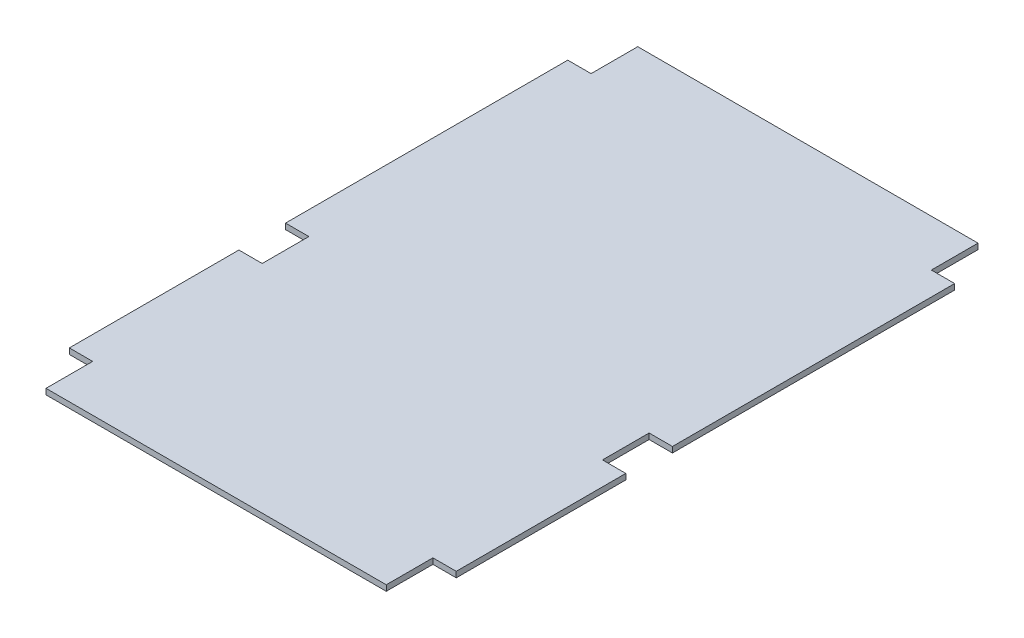
ISO-10303-21;
HEADER;
FILE_DESCRIPTION(('STEP AP214'),'2;1');
FILE_NAME('part.step','',(''),(''),'','','');
FILE_SCHEMA(('AUTOMOTIVE_DESIGN { 1 0 10303 214 1 1 1 1 }'));
ENDSEC;
DATA;
#1=APPLICATION_CONTEXT('core data for automotive mechanical design processes');
#2=APPLICATION_PROTOCOL_DEFINITION('international standard','automotive_design',2000,#1);
#3=PRODUCT_CONTEXT('',#1,'mechanical');
#4=PRODUCT('Part','Part','',(#3));
#5=PRODUCT_RELATED_PRODUCT_CATEGORY('part','',(#4));
#6=PRODUCT_DEFINITION_FORMATION('','',#4);
#7=PRODUCT_DEFINITION_CONTEXT('part definition',#1,'design');
#8=PRODUCT_DEFINITION('design','',#6,#7);
#9=PRODUCT_DEFINITION_SHAPE('','',#8);
#10=(LENGTH_UNIT() NAMED_UNIT(*) SI_UNIT(.MILLI.,.METRE.));
#11=(NAMED_UNIT(*) PLANE_ANGLE_UNIT() SI_UNIT($,.RADIAN.));
#12=(NAMED_UNIT(*) SI_UNIT($,.STERADIAN.) SOLID_ANGLE_UNIT());
#13=UNCERTAINTY_MEASURE_WITH_UNIT(LENGTH_MEASURE(1.E-05),#10,'distance_accuracy_value','');
#14=(GEOMETRIC_REPRESENTATION_CONTEXT(3) GLOBAL_UNCERTAINTY_ASSIGNED_CONTEXT((#13)) GLOBAL_UNIT_ASSIGNED_CONTEXT((#10,
#11,#12)) REPRESENTATION_CONTEXT('',''));
#15=CARTESIAN_POINT('',(0.,0.,0.));
#16=DIRECTION('',(0.,0.,1.));
#17=DIRECTION('',(1.,0.,0.));
#18=AXIS2_PLACEMENT_3D('',#15,#16,#17);
#19=CARTESIAN_POINT('',(0.,5.,0.));
#20=DIRECTION('',(1.,0.,0.));
#21=DIRECTION('',(0.,0.,-1.));
#22=AXIS2_PLACEMENT_3D('',#19,#20,#21);
#23=PLANE('',#22);
#24=DIRECTION('',(0.,0.,1.));
#25=VECTOR('',#24,1.);
#26=CARTESIAN_POINT('',(0.,0.,0.));
#27=LINE('',#26,#25);
#28=CARTESIAN_POINT('',(0.,0.,-479.));
#29=VERTEX_POINT('',#28);
#30=CARTESIAN_POINT('',(0.,0.,-231.));
#31=VERTEX_POINT('',#30);
#32=EDGE_CURVE('E214',#29,#31,#27,.T.);
#33=ORIENTED_EDGE('',*,*,#32,.T.);
#34=DIRECTION('',(0.,1.,0.));
#35=VECTOR('',#34,1.);
#36=CARTESIAN_POINT('',(0.,-10.,-231.));
#37=LINE('',#36,#35);
#38=CARTESIAN_POINT('',(0.,5.,-231.));
#39=VERTEX_POINT('',#38);
#40=EDGE_CURVE('E323',#31,#39,#37,.T.);
#41=ORIENTED_EDGE('',*,*,#40,.T.);
#42=DIRECTION('',(0.,0.,1.));
#43=VECTOR('',#42,1.);
#44=CARTESIAN_POINT('',(0.,5.,0.));
#45=LINE('',#44,#43);
#46=CARTESIAN_POINT('',(0.,5.,-479.));
#47=VERTEX_POINT('',#46);
#48=EDGE_CURVE('E194',#47,#39,#45,.T.);
#49=ORIENTED_EDGE('',*,*,#48,.F.);
#50=DIRECTION('',(0.,1.,0.));
#51=VECTOR('',#50,1.);
#52=CARTESIAN_POINT('',(0.,0.,-479.));
#53=LINE('',#52,#51);
#54=EDGE_CURVE('E292',#29,#47,#53,.T.);
#55=ORIENTED_EDGE('',*,*,#54,.F.);
#56=EDGE_LOOP('',(#33,#41,#49,#55));
#57=FACE_BOUND('',#56,.T.);
#58=ADVANCED_FACE('F35',(#57),#23,.F.);
#59=CARTESIAN_POINT('',(340.,5.,0.));
#60=DIRECTION('',(-1.,0.,0.));
#61=DIRECTION('',(0.,0.,1.));
#62=AXIS2_PLACEMENT_3D('',#59,#60,#61);
#63=PLANE('',#62);
#64=DIRECTION('',(0.,0.,-1.));
#65=VECTOR('',#64,1.);
#66=CARTESIAN_POINT('',(340.,0.,0.));
#67=LINE('',#66,#65);
#68=CARTESIAN_POINT('',(340.,0.,-41.));
#69=VERTEX_POINT('',#68);
#70=CARTESIAN_POINT('',(340.,0.,-190.));
#71=VERTEX_POINT('',#70);
#72=EDGE_CURVE('E199',#69,#71,#67,.T.);
#73=ORIENTED_EDGE('',*,*,#72,.T.);
#74=DIRECTION('',(0.,1.,0.));
#75=VECTOR('',#74,1.);
#76=CARTESIAN_POINT('',(340.,-10.,-190.));
#77=LINE('',#76,#75);
#78=CARTESIAN_POINT('',(340.,5.,-190.));
#79=VERTEX_POINT('',#78);
#80=EDGE_CURVE('E305',#71,#79,#77,.T.);
#81=ORIENTED_EDGE('',*,*,#80,.T.);
#82=DIRECTION('',(0.,0.,-1.));
#83=VECTOR('',#82,1.);
#84=CARTESIAN_POINT('',(340.,5.,0.));
#85=LINE('',#84,#83);
#86=CARTESIAN_POINT('',(340.,5.,-41.));
#87=VERTEX_POINT('',#86);
#88=EDGE_CURVE('E207',#87,#79,#85,.T.);
#89=ORIENTED_EDGE('',*,*,#88,.F.);
#90=DIRECTION('',(0.,1.,0.));
#91=VECTOR('',#90,1.);
#92=CARTESIAN_POINT('',(340.,0.,-41.));
#93=LINE('',#92,#91);
#94=EDGE_CURVE('E260',#69,#87,#93,.T.);
#95=ORIENTED_EDGE('',*,*,#94,.F.);
#96=EDGE_LOOP('',(#73,#81,#89,#95));
#97=FACE_BOUND('',#96,.T.);
#98=ADVANCED_FACE('F368',(#97),#63,.F.);
#99=CARTESIAN_POINT('',(0.,5.,-190.));
#100=VERTEX_POINT('',#99);
#101=CARTESIAN_POINT('',(0.,5.,-41.));
#102=VERTEX_POINT('',#101);
#103=EDGE_CURVE('E185',#100,#102,#45,.T.);
#104=ORIENTED_EDGE('',*,*,#103,.F.);
#105=DIRECTION('',(0.,1.,0.));
#106=VECTOR('',#105,1.);
#107=CARTESIAN_POINT('',(0.,-10.,-190.));
#108=LINE('',#107,#106);
#109=CARTESIAN_POINT('',(0.,0.,-190.));
#110=VERTEX_POINT('',#109);
#111=EDGE_CURVE('E169',#110,#100,#108,.T.);
#112=ORIENTED_EDGE('',*,*,#111,.F.);
#113=CARTESIAN_POINT('',(0.,0.,-41.));
#114=VERTEX_POINT('',#113);
#115=EDGE_CURVE('E218',#110,#114,#27,.T.);
#116=ORIENTED_EDGE('',*,*,#115,.T.);
#117=DIRECTION('',(0.,1.,0.));
#118=VECTOR('',#117,1.);
#119=CARTESIAN_POINT('',(0.,0.,-41.));
#120=LINE('',#119,#118);
#121=EDGE_CURVE('E193',#114,#102,#120,.T.);
#122=ORIENTED_EDGE('',*,*,#121,.T.);
#123=EDGE_LOOP('',(#104,#112,#116,#122));
#124=FACE_BOUND('',#123,.T.);
#125=ADVANCED_FACE('F37',(#124),#23,.F.);
#126=CARTESIAN_POINT('',(0.,5.,0.));
#127=DIRECTION('',(0.,0.,-1.));
#128=DIRECTION('',(-1.,0.,0.));
#129=AXIS2_PLACEMENT_3D('',#126,#127,#128);
#130=PLANE('',#129);
#131=DIRECTION('',(1.,0.,0.));
#132=VECTOR('',#131,1.);
#133=CARTESIAN_POINT('',(0.,5.,0.));
#134=LINE('',#133,#132);
#135=CARTESIAN_POINT('',(20.5,5.,0.));
#136=VERTEX_POINT('',#135);
#137=CARTESIAN_POINT('',(319.5,5.,0.));
#138=VERTEX_POINT('',#137);
#139=EDGE_CURVE('E197',#136,#138,#134,.T.);
#140=ORIENTED_EDGE('',*,*,#139,.F.);
#141=DIRECTION('',(0.,1.,0.));
#142=VECTOR('',#141,1.);
#143=CARTESIAN_POINT('',(20.5,0.,0.));
#144=LINE('',#143,#142);
#145=CARTESIAN_POINT('',(20.5,0.,0.));
#146=VERTEX_POINT('',#145);
#147=EDGE_CURVE('E278',#146,#136,#144,.T.);
#148=ORIENTED_EDGE('',*,*,#147,.F.);
#149=DIRECTION('',(1.,0.,0.));
#150=VECTOR('',#149,1.);
#151=CARTESIAN_POINT('',(0.,0.,0.));
#152=LINE('',#151,#150);
#153=CARTESIAN_POINT('',(319.5,0.,0.));
#154=VERTEX_POINT('',#153);
#155=EDGE_CURVE('E217',#146,#154,#152,.T.);
#156=ORIENTED_EDGE('',*,*,#155,.T.);
#157=DIRECTION('',(0.,1.,0.));
#158=VECTOR('',#157,1.);
#159=CARTESIAN_POINT('',(319.5,0.,0.));
#160=LINE('',#159,#158);
#161=EDGE_CURVE('E254',#154,#138,#160,.T.);
#162=ORIENTED_EDGE('',*,*,#161,.T.);
#163=EDGE_LOOP('',(#140,#148,#156,#162));
#164=FACE_BOUND('',#163,.T.);
#165=ADVANCED_FACE('F376',(#164),#130,.F.);
#166=CARTESIAN_POINT('',(340.,5.,-231.));
#167=VERTEX_POINT('',#166);
#168=CARTESIAN_POINT('',(340.,5.,-479.));
#169=VERTEX_POINT('',#168);
#170=EDGE_CURVE('E206',#167,#169,#85,.T.);
#171=ORIENTED_EDGE('',*,*,#170,.F.);
#172=DIRECTION('',(0.,1.,0.));
#173=VECTOR('',#172,1.);
#174=CARTESIAN_POINT('',(340.,-10.,-231.));
#175=LINE('',#174,#173);
#176=CARTESIAN_POINT('',(340.,0.,-231.));
#177=VERTEX_POINT('',#176);
#178=EDGE_CURVE('E310',#177,#167,#175,.T.);
#179=ORIENTED_EDGE('',*,*,#178,.F.);
#180=CARTESIAN_POINT('',(340.,0.,-479.));
#181=VERTEX_POINT('',#180);
#182=EDGE_CURVE('E220',#177,#181,#67,.T.);
#183=ORIENTED_EDGE('',*,*,#182,.T.);
#184=DIRECTION('',(0.,1.,0.));
#185=VECTOR('',#184,1.);
#186=CARTESIAN_POINT('',(340.,0.,-479.));
#187=LINE('',#186,#185);
#188=EDGE_CURVE('E239',#181,#169,#187,.T.);
#189=ORIENTED_EDGE('',*,*,#188,.T.);
#190=EDGE_LOOP('',(#171,#179,#183,#189));
#191=FACE_BOUND('',#190,.T.);
#192=ADVANCED_FACE('F374',(#191),#63,.F.);
#193=CARTESIAN_POINT('',(0.,5.,-520.));
#194=DIRECTION('',(0.,0.,1.));
#195=DIRECTION('',(1.,0.,0.));
#196=AXIS2_PLACEMENT_3D('',#193,#194,#195);
#197=PLANE('',#196);
#198=DIRECTION('',(-1.,0.,0.));
#199=VECTOR('',#198,1.);
#200=CARTESIAN_POINT('',(0.,0.,-520.));
#201=LINE('',#200,#199);
#202=CARTESIAN_POINT('',(319.5,0.,-520.));
#203=VERTEX_POINT('',#202);
#204=CARTESIAN_POINT('',(20.5,0.,-520.));
#205=VERTEX_POINT('',#204);
#206=EDGE_CURVE('E195',#203,#205,#201,.T.);
#207=ORIENTED_EDGE('',*,*,#206,.T.);
#208=DIRECTION('',(0.,1.,0.));
#209=VECTOR('',#208,1.);
#210=CARTESIAN_POINT('',(20.5,0.,-520.));
#211=LINE('',#210,#209);
#212=CARTESIAN_POINT('',(20.5,5.,-520.));
#213=VERTEX_POINT('',#212);
#214=EDGE_CURVE('E289',#205,#213,#211,.T.);
#215=ORIENTED_EDGE('',*,*,#214,.T.);
#216=DIRECTION('',(-1.,0.,0.));
#217=VECTOR('',#216,1.);
#218=CARTESIAN_POINT('',(0.,5.,-520.));
#219=LINE('',#218,#217);
#220=CARTESIAN_POINT('',(319.5,5.,-520.));
#221=VERTEX_POINT('',#220);
#222=EDGE_CURVE('E210',#221,#213,#219,.T.);
#223=ORIENTED_EDGE('',*,*,#222,.F.);
#224=DIRECTION('',(0.,1.,0.));
#225=VECTOR('',#224,1.);
#226=CARTESIAN_POINT('',(319.5,0.,-520.));
#227=LINE('',#226,#225);
#228=EDGE_CURVE('E203',#203,#221,#227,.T.);
#229=ORIENTED_EDGE('',*,*,#228,.F.);
#230=EDGE_LOOP('',(#207,#215,#223,#229));
#231=FACE_BOUND('',#230,.T.);
#232=ADVANCED_FACE('F346',(#231),#197,.F.);
#233=CARTESIAN_POINT('',(0.,5.,0.));
#234=DIRECTION('',(0.,-1.,0.));
#235=DIRECTION('',(0.,0.,-1.));
#236=AXIS2_PLACEMENT_3D('',#233,#234,#235);
#237=PLANE('',#236);
#238=ORIENTED_EDGE('',*,*,#48,.T.);
#239=DIRECTION('',(-1.,0.,0.));
#240=VECTOR('',#239,1.);
#241=CARTESIAN_POINT('',(0.,5.,-231.));
#242=LINE('',#241,#240);
#243=CARTESIAN_POINT('',(20.5,5.,-231.));
#244=VERTEX_POINT('',#243);
#245=EDGE_CURVE('E179',#244,#39,#242,.T.);
#246=ORIENTED_EDGE('',*,*,#245,.F.);
#247=DIRECTION('',(0.,0.,-1.));
#248=VECTOR('',#247,1.);
#249=CARTESIAN_POINT('',(20.5,5.,-231.));
#250=LINE('',#249,#248);
#251=CARTESIAN_POINT('',(20.5,5.,-190.));
#252=VERTEX_POINT('',#251);
#253=EDGE_CURVE('E189',#252,#244,#250,.T.);
#254=ORIENTED_EDGE('',*,*,#253,.F.);
#255=DIRECTION('',(1.,0.,0.));
#256=VECTOR('',#255,1.);
#257=CARTESIAN_POINT('',(0.,5.,-190.));
#258=LINE('',#257,#256);
#259=EDGE_CURVE('E172',#100,#252,#258,.T.);
#260=ORIENTED_EDGE('',*,*,#259,.F.);
#261=ORIENTED_EDGE('',*,*,#103,.T.);
#262=DIRECTION('',(-1.,0.,0.));
#263=VECTOR('',#262,1.);
#264=CARTESIAN_POINT('',(0.,5.,-41.));
#265=LINE('',#264,#263);
#266=CARTESIAN_POINT('',(20.5000000000001,5.,-41.));
#267=VERTEX_POINT('',#266);
#268=EDGE_CURVE('E283',#267,#102,#265,.T.);
#269=ORIENTED_EDGE('',*,*,#268,.F.);
#270=DIRECTION('',(0.,0.,-1.));
#271=VECTOR('',#270,1.);
#272=CARTESIAN_POINT('',(20.5,5.,0.));
#273=LINE('',#272,#271);
#274=EDGE_CURVE('E286',#136,#267,#273,.T.);
#275=ORIENTED_EDGE('',*,*,#274,.F.);
#276=ORIENTED_EDGE('',*,*,#139,.T.);
#277=DIRECTION('',(0.,0.,1.));
#278=VECTOR('',#277,1.);
#279=CARTESIAN_POINT('',(319.5,5.,0.));
#280=LINE('',#279,#278);
#281=CARTESIAN_POINT('',(319.5,5.,-41.));
#282=VERTEX_POINT('',#281);
#283=EDGE_CURVE('E267',#282,#138,#280,.T.);
#284=ORIENTED_EDGE('',*,*,#283,.F.);
#285=DIRECTION('',(-1.,0.,0.));
#286=VECTOR('',#285,1.);
#287=CARTESIAN_POINT('',(340.,5.,-41.));
#288=LINE('',#287,#286);
#289=EDGE_CURVE('E271',#87,#282,#288,.T.);
#290=ORIENTED_EDGE('',*,*,#289,.F.);
#291=ORIENTED_EDGE('',*,*,#88,.T.);
#292=DIRECTION('',(1.,0.,0.));
#293=VECTOR('',#292,1.);
#294=CARTESIAN_POINT('',(340.,5.,-190.));
#295=LINE('',#294,#293);
#296=CARTESIAN_POINT('',(319.5,5.,-190.));
#297=VERTEX_POINT('',#296);
#298=EDGE_CURVE('E312',#297,#79,#295,.T.);
#299=ORIENTED_EDGE('',*,*,#298,.F.);
#300=DIRECTION('',(0.,0.,1.));
#301=VECTOR('',#300,1.);
#302=CARTESIAN_POINT('',(319.5,5.,-231.));
#303=LINE('',#302,#301);
#304=CARTESIAN_POINT('',(319.5,5.,-231.));
#305=VERTEX_POINT('',#304);
#306=EDGE_CURVE('E319',#305,#297,#303,.T.);
#307=ORIENTED_EDGE('',*,*,#306,.F.);
#308=DIRECTION('',(-1.,0.,0.));
#309=VECTOR('',#308,1.);
#310=CARTESIAN_POINT('',(340.,5.,-231.));
#311=LINE('',#310,#309);
#312=EDGE_CURVE('E322',#167,#305,#311,.T.);
#313=ORIENTED_EDGE('',*,*,#312,.F.);
#314=ORIENTED_EDGE('',*,*,#170,.T.);
#315=DIRECTION('',(1.,0.,0.));
#316=VECTOR('',#315,1.);
#317=CARTESIAN_POINT('',(340.,5.,-479.));
#318=LINE('',#317,#316);
#319=CARTESIAN_POINT('',(319.5,5.,-479.));
#320=VERTEX_POINT('',#319);
#321=EDGE_CURVE('E247',#320,#169,#318,.T.);
#322=ORIENTED_EDGE('',*,*,#321,.F.);
#323=DIRECTION('',(0.,0.,1.));
#324=VECTOR('',#323,1.);
#325=CARTESIAN_POINT('',(319.5,5.,-520.));
#326=LINE('',#325,#324);
#327=EDGE_CURVE('E251',#221,#320,#326,.T.);
#328=ORIENTED_EDGE('',*,*,#327,.F.);
#329=ORIENTED_EDGE('',*,*,#222,.T.);
#330=DIRECTION('',(0.,0.,-1.));
#331=VECTOR('',#330,1.);
#332=CARTESIAN_POINT('',(20.5,5.,-520.));
#333=LINE('',#332,#331);
#334=CARTESIAN_POINT('',(20.5,5.,-479.));
#335=VERTEX_POINT('',#334);
#336=EDGE_CURVE('E299',#335,#213,#333,.T.);
#337=ORIENTED_EDGE('',*,*,#336,.F.);
#338=DIRECTION('',(1.,0.,0.));
#339=VECTOR('',#338,1.);
#340=CARTESIAN_POINT('',(0.,5.,-479.));
#341=LINE('',#340,#339);
#342=EDGE_CURVE('E302',#47,#335,#341,.T.);
#343=ORIENTED_EDGE('',*,*,#342,.F.);
#344=EDGE_LOOP('',(#238,#246,#254,#260,#261,#269,#275,#276,#284,#290,#291,#299,#307,#313,#314,
#322,#328,#329,#337,#343));
#345=FACE_BOUND('',#344,.T.);
#346=ADVANCED_FACE('F183',(#345),#237,.F.);
#347=CARTESIAN_POINT('',(0.,0.,0.));
#348=DIRECTION('',(0.,-1.,0.));
#349=DIRECTION('',(0.,0.,-1.));
#350=AXIS2_PLACEMENT_3D('',#347,#348,#349);
#351=PLANE('',#350);
#352=DIRECTION('',(1.,0.,0.));
#353=VECTOR('',#352,1.);
#354=CARTESIAN_POINT('',(0.,0.,-231.));
#355=LINE('',#354,#353);
#356=CARTESIAN_POINT('',(20.5,0.,-231.));
#357=VERTEX_POINT('',#356);
#358=EDGE_CURVE('E11',#31,#357,#355,.T.);
#359=ORIENTED_EDGE('',*,*,#358,.F.);
#360=ORIENTED_EDGE('',*,*,#32,.F.);
#361=DIRECTION('',(1.,0.,0.));
#362=VECTOR('',#361,1.);
#363=CARTESIAN_POINT('',(0.,0.,-479.));
#364=LINE('',#363,#362);
#365=CARTESIAN_POINT('',(20.5,0.,-479.));
#366=VERTEX_POINT('',#365);
#367=EDGE_CURVE('E301',#29,#366,#364,.T.);
#368=ORIENTED_EDGE('',*,*,#367,.T.);
#369=DIRECTION('',(0.,0.,-1.));
#370=VECTOR('',#369,1.);
#371=CARTESIAN_POINT('',(20.5,0.,-520.));
#372=LINE('',#371,#370);
#373=EDGE_CURVE('E295',#366,#205,#372,.T.);
#374=ORIENTED_EDGE('',*,*,#373,.T.);
#375=ORIENTED_EDGE('',*,*,#206,.F.);
#376=DIRECTION('',(0.,0.,1.));
#377=VECTOR('',#376,1.);
#378=CARTESIAN_POINT('',(319.5,0.,-520.));
#379=LINE('',#378,#377);
#380=CARTESIAN_POINT('',(319.5,0.,-479.));
#381=VERTEX_POINT('',#380);
#382=EDGE_CURVE('E250',#203,#381,#379,.T.);
#383=ORIENTED_EDGE('',*,*,#382,.T.);
#384=DIRECTION('',(1.,0.,0.));
#385=VECTOR('',#384,1.);
#386=CARTESIAN_POINT('',(340.,0.,-479.));
#387=LINE('',#386,#385);
#388=EDGE_CURVE('E255',#381,#181,#387,.T.);
#389=ORIENTED_EDGE('',*,*,#388,.T.);
#390=ORIENTED_EDGE('',*,*,#182,.F.);
#391=DIRECTION('',(1.,0.,0.));
#392=VECTOR('',#391,1.);
#393=CARTESIAN_POINT('',(3.12757949620014E-13,0.,-231.));
#394=LINE('',#393,#392);
#395=CARTESIAN_POINT('',(319.5,0.,-231.));
#396=VERTEX_POINT('',#395);
#397=EDGE_CURVE('E213',#396,#177,#394,.T.);
#398=ORIENTED_EDGE('',*,*,#397,.F.);
#399=DIRECTION('',(0.,0.,-1.));
#400=VECTOR('',#399,1.);
#401=CARTESIAN_POINT('',(319.5,0.,0.));
#402=LINE('',#401,#400);
#403=CARTESIAN_POINT('',(319.5,0.,-190.));
#404=VERTEX_POINT('',#403);
#405=EDGE_CURVE('E224',#404,#396,#402,.T.);
#406=ORIENTED_EDGE('',*,*,#405,.F.);
#407=DIRECTION('',(-1.,0.,0.));
#408=VECTOR('',#407,1.);
#409=CARTESIAN_POINT('',(0.,0.,-190.));
#410=LINE('',#409,#408);
#411=EDGE_CURVE('E226',#71,#404,#410,.T.);
#412=ORIENTED_EDGE('',*,*,#411,.F.);
#413=ORIENTED_EDGE('',*,*,#72,.F.);
#414=DIRECTION('',(-1.,0.,0.));
#415=VECTOR('',#414,1.);
#416=CARTESIAN_POINT('',(340.,0.,-41.));
#417=LINE('',#416,#415);
#418=CARTESIAN_POINT('',(319.5,0.,-41.));
#419=VERTEX_POINT('',#418);
#420=EDGE_CURVE('E270',#69,#419,#417,.T.);
#421=ORIENTED_EDGE('',*,*,#420,.T.);
#422=DIRECTION('',(0.,0.,1.));
#423=VECTOR('',#422,1.);
#424=CARTESIAN_POINT('',(319.5,0.,0.));
#425=LINE('',#424,#423);
#426=EDGE_CURVE('E263',#419,#154,#425,.T.);
#427=ORIENTED_EDGE('',*,*,#426,.T.);
#428=ORIENTED_EDGE('',*,*,#155,.F.);
#429=DIRECTION('',(0.,0.,-1.));
#430=VECTOR('',#429,1.);
#431=CARTESIAN_POINT('',(20.5,0.,0.));
#432=LINE('',#431,#430);
#433=CARTESIAN_POINT('',(20.5000000000001,0.,-41.));
#434=VERTEX_POINT('',#433);
#435=EDGE_CURVE('E285',#146,#434,#432,.T.);
#436=ORIENTED_EDGE('',*,*,#435,.T.);
#437=DIRECTION('',(-1.,0.,0.));
#438=VECTOR('',#437,1.);
#439=CARTESIAN_POINT('',(0.,0.,-41.));
#440=LINE('',#439,#438);
#441=EDGE_CURVE('E238',#434,#114,#440,.T.);
#442=ORIENTED_EDGE('',*,*,#441,.T.);
#443=ORIENTED_EDGE('',*,*,#115,.F.);
#444=DIRECTION('',(-1.,0.,0.));
#445=VECTOR('',#444,1.);
#446=CARTESIAN_POINT('',(0.,0.,-190.));
#447=LINE('',#446,#445);
#448=CARTESIAN_POINT('',(20.5,0.,-190.));
#449=VERTEX_POINT('',#448);
#450=EDGE_CURVE('E175',#449,#110,#447,.T.);
#451=ORIENTED_EDGE('',*,*,#450,.F.);
#452=DIRECTION('',(0.,0.,1.));
#453=VECTOR('',#452,1.);
#454=CARTESIAN_POINT('',(20.5000000000001,0.,0.));
#455=LINE('',#454,#453);
#456=EDGE_CURVE('E43',#357,#449,#455,.T.);
#457=ORIENTED_EDGE('',*,*,#456,.F.);
#458=EDGE_LOOP('',(#359,#360,#368,#374,#375,#383,#389,#390,#398,#406,#412,#413,#421,#427,#428,
#436,#442,#443,#451,#457));
#459=FACE_BOUND('',#458,.T.);
#460=ADVANCED_FACE('F235',(#459),#351,.T.);
#461=CARTESIAN_POINT('',(340.,0.,-479.));
#462=DIRECTION('',(0.,0.,1.));
#463=DIRECTION('',(1.,0.,0.));
#464=AXIS2_PLACEMENT_3D('',#461,#462,#463);
#465=PLANE('',#464);
#466=ORIENTED_EDGE('',*,*,#321,.T.);
#467=ORIENTED_EDGE('',*,*,#188,.F.);
#468=ORIENTED_EDGE('',*,*,#388,.F.);
#469=DIRECTION('',(0.,1.,0.));
#470=VECTOR('',#469,1.);
#471=CARTESIAN_POINT('',(319.5,0.,-479.));
#472=LINE('',#471,#470);
#473=EDGE_CURVE('E241',#381,#320,#472,.T.);
#474=ORIENTED_EDGE('',*,*,#473,.T.);
#475=EDGE_LOOP('',(#466,#467,#468,#474));
#476=FACE_BOUND('',#475,.T.);
#477=ADVANCED_FACE('F356',(#476),#465,.F.);
#478=CARTESIAN_POINT('',(319.5,0.,-520.));
#479=DIRECTION('',(-1.,0.,0.));
#480=DIRECTION('',(0.,0.,1.));
#481=AXIS2_PLACEMENT_3D('',#478,#479,#480);
#482=PLANE('',#481);
#483=ORIENTED_EDGE('',*,*,#327,.T.);
#484=ORIENTED_EDGE('',*,*,#473,.F.);
#485=ORIENTED_EDGE('',*,*,#382,.F.);
#486=ORIENTED_EDGE('',*,*,#228,.T.);
#487=EDGE_LOOP('',(#483,#484,#485,#486));
#488=FACE_BOUND('',#487,.T.);
#489=ADVANCED_FACE('F352',(#488),#482,.F.);
#490=CARTESIAN_POINT('',(319.5,0.,0.));
#491=DIRECTION('',(-1.,0.,0.));
#492=DIRECTION('',(0.,0.,1.));
#493=AXIS2_PLACEMENT_3D('',#490,#491,#492);
#494=PLANE('',#493);
#495=ORIENTED_EDGE('',*,*,#283,.T.);
#496=ORIENTED_EDGE('',*,*,#161,.F.);
#497=ORIENTED_EDGE('',*,*,#426,.F.);
#498=DIRECTION('',(0.,1.,0.));
#499=VECTOR('',#498,1.);
#500=CARTESIAN_POINT('',(319.5,0.,-41.));
#501=LINE('',#500,#499);
#502=EDGE_CURVE('E262',#419,#282,#501,.T.);
#503=ORIENTED_EDGE('',*,*,#502,.T.);
#504=EDGE_LOOP('',(#495,#496,#497,#503));
#505=FACE_BOUND('',#504,.T.);
#506=ADVANCED_FACE('F363',(#505),#494,.F.);
#507=CARTESIAN_POINT('',(340.,0.,-41.));
#508=DIRECTION('',(0.,0.,-1.));
#509=DIRECTION('',(-1.,0.,0.));
#510=AXIS2_PLACEMENT_3D('',#507,#508,#509);
#511=PLANE('',#510);
#512=ORIENTED_EDGE('',*,*,#289,.T.);
#513=ORIENTED_EDGE('',*,*,#502,.F.);
#514=ORIENTED_EDGE('',*,*,#420,.F.);
#515=ORIENTED_EDGE('',*,*,#94,.T.);
#516=EDGE_LOOP('',(#512,#513,#514,#515));
#517=FACE_BOUND('',#516,.T.);
#518=ADVANCED_FACE('F466',(#517),#511,.F.);
#519=CARTESIAN_POINT('',(0.,0.,-41.));
#520=DIRECTION('',(0.,0.,-1.));
#521=DIRECTION('',(-1.,0.,0.));
#522=AXIS2_PLACEMENT_3D('',#519,#520,#521);
#523=PLANE('',#522);
#524=ORIENTED_EDGE('',*,*,#268,.T.);
#525=ORIENTED_EDGE('',*,*,#121,.F.);
#526=ORIENTED_EDGE('',*,*,#441,.F.);
#527=DIRECTION('',(0.,1.,0.));
#528=VECTOR('',#527,1.);
#529=CARTESIAN_POINT('',(20.5000000000001,0.,-41.));
#530=LINE('',#529,#528);
#531=EDGE_CURVE('E280',#434,#267,#530,.T.);
#532=ORIENTED_EDGE('',*,*,#531,.T.);
#533=EDGE_LOOP('',(#524,#525,#526,#532));
#534=FACE_BOUND('',#533,.T.);
#535=ADVANCED_FACE('F463',(#534),#523,.F.);
#536=CARTESIAN_POINT('',(20.5,0.,0.));
#537=DIRECTION('',(1.,0.,0.));
#538=DIRECTION('',(0.,0.,-1.));
#539=AXIS2_PLACEMENT_3D('',#536,#537,#538);
#540=PLANE('',#539);
#541=ORIENTED_EDGE('',*,*,#274,.T.);
#542=ORIENTED_EDGE('',*,*,#531,.F.);
#543=ORIENTED_EDGE('',*,*,#435,.F.);
#544=ORIENTED_EDGE('',*,*,#147,.T.);
#545=EDGE_LOOP('',(#541,#542,#543,#544));
#546=FACE_BOUND('',#545,.T.);
#547=ADVANCED_FACE('F461',(#546),#540,.F.);
#548=CARTESIAN_POINT('',(20.5,0.,-520.));
#549=DIRECTION('',(1.,0.,0.));
#550=DIRECTION('',(0.,0.,-1.));
#551=AXIS2_PLACEMENT_3D('',#548,#549,#550);
#552=PLANE('',#551);
#553=ORIENTED_EDGE('',*,*,#336,.T.);
#554=ORIENTED_EDGE('',*,*,#214,.F.);
#555=ORIENTED_EDGE('',*,*,#373,.F.);
#556=DIRECTION('',(0.,1.,0.));
#557=VECTOR('',#556,1.);
#558=CARTESIAN_POINT('',(20.5,0.,-479.));
#559=LINE('',#558,#557);
#560=EDGE_CURVE('E294',#366,#335,#559,.T.);
#561=ORIENTED_EDGE('',*,*,#560,.T.);
#562=EDGE_LOOP('',(#553,#554,#555,#561));
#563=FACE_BOUND('',#562,.T.);
#564=ADVANCED_FACE('F343',(#563),#552,.F.);
#565=CARTESIAN_POINT('',(0.,0.,-479.));
#566=DIRECTION('',(0.,0.,1.));
#567=DIRECTION('',(1.,0.,0.));
#568=AXIS2_PLACEMENT_3D('',#565,#566,#567);
#569=PLANE('',#568);
#570=ORIENTED_EDGE('',*,*,#342,.T.);
#571=ORIENTED_EDGE('',*,*,#560,.F.);
#572=ORIENTED_EDGE('',*,*,#367,.F.);
#573=ORIENTED_EDGE('',*,*,#54,.T.);
#574=EDGE_LOOP('',(#570,#571,#572,#573));
#575=FACE_BOUND('',#574,.T.);
#576=ADVANCED_FACE('F340',(#575),#569,.F.);
#577=CARTESIAN_POINT('',(340.,-10.,-190.));
#578=DIRECTION('',(0.,0.,1.));
#579=DIRECTION('',(1.,0.,0.));
#580=AXIS2_PLACEMENT_3D('',#577,#578,#579);
#581=PLANE('',#580);
#582=ORIENTED_EDGE('',*,*,#411,.T.);
#583=DIRECTION('',(0.,1.,0.));
#584=VECTOR('',#583,1.);
#585=CARTESIAN_POINT('',(319.5,-10.,-190.));
#586=LINE('',#585,#584);
#587=EDGE_CURVE('E314',#404,#297,#586,.T.);
#588=ORIENTED_EDGE('',*,*,#587,.T.);
#589=ORIENTED_EDGE('',*,*,#298,.T.);
#590=ORIENTED_EDGE('',*,*,#80,.F.);
#591=EDGE_LOOP('',(#582,#588,#589,#590));
#592=FACE_BOUND('',#591,.T.);
#593=ADVANCED_FACE('F404',(#592),#581,.F.);
#594=CARTESIAN_POINT('',(319.5,-10.,-231.));
#595=DIRECTION('',(-1.,0.,0.));
#596=DIRECTION('',(0.,0.,1.));
#597=AXIS2_PLACEMENT_3D('',#594,#595,#596);
#598=PLANE('',#597);
#599=ORIENTED_EDGE('',*,*,#405,.T.);
#600=DIRECTION('',(0.,1.,0.));
#601=VECTOR('',#600,1.);
#602=CARTESIAN_POINT('',(319.5,-10.,-231.));
#603=LINE('',#602,#601);
#604=EDGE_CURVE('E58',#396,#305,#603,.T.);
#605=ORIENTED_EDGE('',*,*,#604,.T.);
#606=ORIENTED_EDGE('',*,*,#306,.T.);
#607=ORIENTED_EDGE('',*,*,#587,.F.);
#608=EDGE_LOOP('',(#599,#605,#606,#607));
#609=FACE_BOUND('',#608,.T.);
#610=ADVANCED_FACE('F409',(#609),#598,.F.);
#611=CARTESIAN_POINT('',(340.,-10.,-231.));
#612=DIRECTION('',(0.,0.,-1.));
#613=DIRECTION('',(-1.,0.,0.));
#614=AXIS2_PLACEMENT_3D('',#611,#612,#613);
#615=PLANE('',#614);
#616=ORIENTED_EDGE('',*,*,#397,.T.);
#617=ORIENTED_EDGE('',*,*,#178,.T.);
#618=ORIENTED_EDGE('',*,*,#312,.T.);
#619=ORIENTED_EDGE('',*,*,#604,.F.);
#620=EDGE_LOOP('',(#616,#617,#618,#619));
#621=FACE_BOUND('',#620,.T.);
#622=ADVANCED_FACE('F421',(#621),#615,.F.);
#623=CARTESIAN_POINT('',(0.,-10.,-231.));
#624=DIRECTION('',(0.,0.,-1.));
#625=DIRECTION('',(-1.,0.,0.));
#626=AXIS2_PLACEMENT_3D('',#623,#624,#625);
#627=PLANE('',#626);
#628=ORIENTED_EDGE('',*,*,#358,.T.);
#629=DIRECTION('',(0.,1.,0.));
#630=VECTOR('',#629,1.);
#631=CARTESIAN_POINT('',(20.5,-10.,-231.));
#632=LINE('',#631,#630);
#633=EDGE_CURVE('E232',#357,#244,#632,.T.);
#634=ORIENTED_EDGE('',*,*,#633,.T.);
#635=ORIENTED_EDGE('',*,*,#245,.T.);
#636=ORIENTED_EDGE('',*,*,#40,.F.);
#637=EDGE_LOOP('',(#628,#634,#635,#636));
#638=FACE_BOUND('',#637,.T.);
#639=ADVANCED_FACE('F333',(#638),#627,.F.);
#640=CARTESIAN_POINT('',(20.5,-10.,-231.));
#641=DIRECTION('',(1.,0.,0.));
#642=DIRECTION('',(0.,0.,-1.));
#643=AXIS2_PLACEMENT_3D('',#640,#641,#642);
#644=PLANE('',#643);
#645=ORIENTED_EDGE('',*,*,#456,.T.);
#646=DIRECTION('',(0.,1.,0.));
#647=VECTOR('',#646,1.);
#648=CARTESIAN_POINT('',(20.5,-10.,-190.));
#649=LINE('',#648,#647);
#650=EDGE_CURVE('E50',#449,#252,#649,.T.);
#651=ORIENTED_EDGE('',*,*,#650,.T.);
#652=ORIENTED_EDGE('',*,*,#253,.T.);
#653=ORIENTED_EDGE('',*,*,#633,.F.);
#654=EDGE_LOOP('',(#645,#651,#652,#653));
#655=FACE_BOUND('',#654,.T.);
#656=ADVANCED_FACE('F231',(#655),#644,.F.);
#657=CARTESIAN_POINT('',(0.,-10.,-190.));
#658=DIRECTION('',(0.,0.,1.));
#659=DIRECTION('',(1.,0.,0.));
#660=AXIS2_PLACEMENT_3D('',#657,#658,#659);
#661=PLANE('',#660);
#662=ORIENTED_EDGE('',*,*,#450,.T.);
#663=ORIENTED_EDGE('',*,*,#111,.T.);
#664=ORIENTED_EDGE('',*,*,#259,.T.);
#665=ORIENTED_EDGE('',*,*,#650,.F.);
#666=EDGE_LOOP('',(#662,#663,#664,#665));
#667=FACE_BOUND('',#666,.T.);
#668=ADVANCED_FACE('F171',(#667),#661,.F.);
#669=CLOSED_SHELL('',(#58,#98,#125,#165,#192,#232,#346,#460,#477,#489,#506,#518,#535,#547,#564,
#576,#593,#610,#622,#639,#656,#668));
#670=MANIFOLD_SOLID_BREP('B2',#669);
#671=ADVANCED_BREP_SHAPE_REPRESENTATION('',(#18,#670),#14);
#672=SHAPE_DEFINITION_REPRESENTATION(#9,#671);
ENDSEC;
END-ISO-10303-21;
